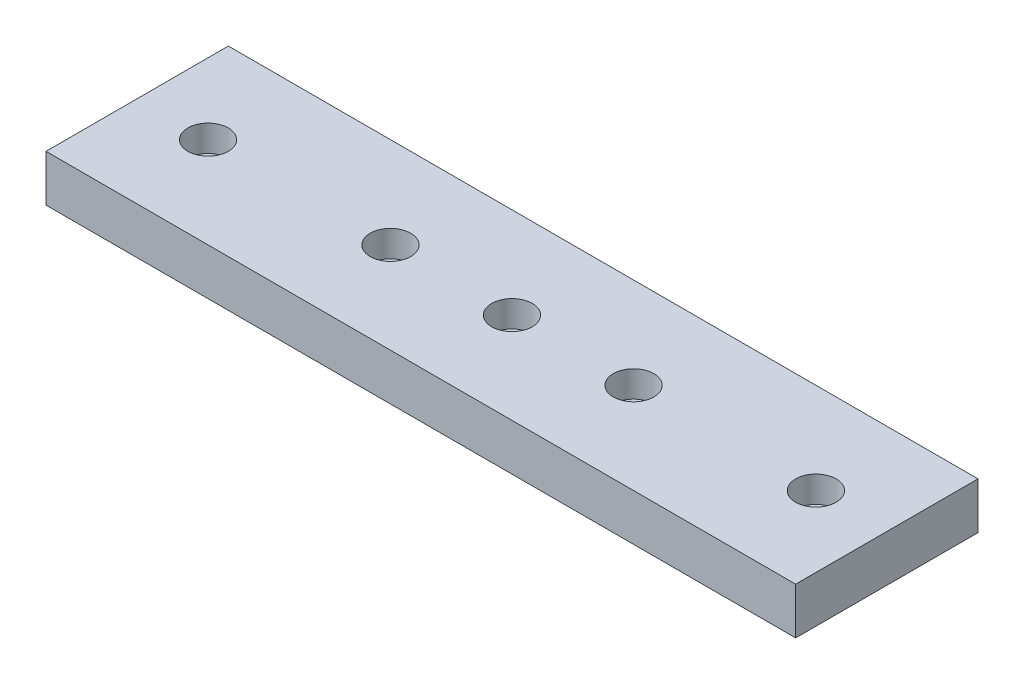
ISO-10303-21;
HEADER;
FILE_DESCRIPTION(('STEP AP214'),'2;1');
FILE_NAME('part.step','',(''),(''),'','','');
FILE_SCHEMA(('AUTOMOTIVE_DESIGN { 1 0 10303 214 1 1 1 1 }'));
ENDSEC;
DATA;
#1=APPLICATION_CONTEXT('core data for automotive mechanical design processes');
#2=APPLICATION_PROTOCOL_DEFINITION('international standard','automotive_design',2000,#1);
#3=PRODUCT_CONTEXT('',#1,'mechanical');
#4=PRODUCT('Part','Part','',(#3));
#5=PRODUCT_RELATED_PRODUCT_CATEGORY('part','',(#4));
#6=PRODUCT_DEFINITION_FORMATION('','',#4);
#7=PRODUCT_DEFINITION_CONTEXT('part definition',#1,'design');
#8=PRODUCT_DEFINITION('design','',#6,#7);
#9=PRODUCT_DEFINITION_SHAPE('','',#8);
#10=(LENGTH_UNIT() NAMED_UNIT(*) SI_UNIT(.MILLI.,.METRE.));
#11=(NAMED_UNIT(*) PLANE_ANGLE_UNIT() SI_UNIT($,.RADIAN.));
#12=(NAMED_UNIT(*) SI_UNIT($,.STERADIAN.) SOLID_ANGLE_UNIT());
#13=UNCERTAINTY_MEASURE_WITH_UNIT(LENGTH_MEASURE(1.E-05),#10,'distance_accuracy_value','');
#14=(GEOMETRIC_REPRESENTATION_CONTEXT(3) GLOBAL_UNCERTAINTY_ASSIGNED_CONTEXT((#13)) GLOBAL_UNIT_ASSIGNED_CONTEXT((#10,
#11,#12)) REPRESENTATION_CONTEXT('',''));
#15=CARTESIAN_POINT('',(0.,0.,0.));
#16=DIRECTION('',(0.,0.,1.));
#17=DIRECTION('',(1.,0.,0.));
#18=AXIS2_PLACEMENT_3D('',#15,#16,#17);
#19=CARTESIAN_POINT('',(150.,23.,0.));
#20=DIRECTION('',(0.,1.,0.));
#21=DIRECTION('',(0.,0.,1.));
#22=AXIS2_PLACEMENT_3D('',#19,#20,#21);
#23=CYLINDRICAL_SURFACE('',#22,6.75000000000001);
#24=CARTESIAN_POINT('',(150.,0.,0.));
#25=DIRECTION('',(0.,1.,0.));
#26=DIRECTION('',(0.,0.,1.));
#27=AXIS2_PLACEMENT_3D('',#24,#25,#26);
#28=CIRCLE('',#27,6.75000000000001);
#29=CARTESIAN_POINT('',(150.,0.,6.74999999999992));
#30=VERTEX_POINT('',#29);
#31=EDGE_CURVE('E11',#30,#30,#28,.T.);
#32=ORIENTED_EDGE('',*,*,#31,.F.);
#33=EDGE_LOOP('',(#32));
#34=FACE_BOUND('',#33,.T.);
#35=CARTESIAN_POINT('',(150.,10.,0.));
#36=DIRECTION('',(0.,1.,0.));
#37=DIRECTION('',(0.,0.,1.));
#38=AXIS2_PLACEMENT_3D('',#35,#36,#37);
#39=CIRCLE('',#38,6.75000000000001);
#40=CARTESIAN_POINT('',(150.,10.,6.74999999999992));
#41=VERTEX_POINT('',#40);
#42=EDGE_CURVE('E48',#41,#41,#39,.T.);
#43=ORIENTED_EDGE('',*,*,#42,.T.);
#44=EDGE_LOOP('',(#43));
#45=FACE_BOUND('',#44,.T.);
#46=ADVANCED_FACE('F39',(#34,#45),#23,.F.);
#47=CARTESIAN_POINT('',(156.75,10.,0.));
#48=DIRECTION('',(0.,-1.,0.));
#49=DIRECTION('',(0.,0.,-1.));
#50=AXIS2_PLACEMENT_3D('',#47,#48,#49);
#51=PLANE('',#50);
#52=ORIENTED_EDGE('',*,*,#42,.F.);
#53=EDGE_LOOP('',(#52));
#54=FACE_BOUND('',#53,.T.);
#55=CARTESIAN_POINT('',(150.,10.,0.));
#56=DIRECTION('',(0.,1.,0.));
#57=DIRECTION('',(0.,0.,1.));
#58=AXIS2_PLACEMENT_3D('',#55,#56,#57);
#59=CIRCLE('',#58,10.);
#60=CARTESIAN_POINT('',(150.,10.,9.99999999999992));
#61=VERTEX_POINT('',#60);
#62=EDGE_CURVE('E161',#61,#61,#59,.T.);
#63=ORIENTED_EDGE('',*,*,#62,.T.);
#64=EDGE_LOOP('',(#63));
#65=FACE_BOUND('',#64,.T.);
#66=ADVANCED_FACE('F173',(#54,#65),#51,.F.);
#67=CARTESIAN_POINT('',(150.,23.,0.));
#68=DIRECTION('',(0.,1.,0.));
#69=DIRECTION('',(0.,0.,1.));
#70=AXIS2_PLACEMENT_3D('',#67,#68,#69);
#71=CYLINDRICAL_SURFACE('',#70,10.);
#72=ORIENTED_EDGE('',*,*,#62,.F.);
#73=EDGE_LOOP('',(#72));
#74=FACE_BOUND('',#73,.T.);
#75=CARTESIAN_POINT('',(150.,23.,0.));
#76=DIRECTION('',(0.,1.,0.));
#77=DIRECTION('',(0.,0.,1.));
#78=AXIS2_PLACEMENT_3D('',#75,#76,#77);
#79=CIRCLE('',#78,10.);
#80=CARTESIAN_POINT('',(150.,23.,9.99999999999992));
#81=VERTEX_POINT('',#80);
#82=EDGE_CURVE('E165',#81,#81,#79,.T.);
#83=ORIENTED_EDGE('',*,*,#82,.T.);
#84=EDGE_LOOP('',(#83));
#85=FACE_BOUND('',#84,.T.);
#86=ADVANCED_FACE('F176',(#74,#85),#71,.F.);
#87=CARTESIAN_POINT('',(60.,23.,0.));
#88=DIRECTION('',(0.,1.,0.));
#89=DIRECTION('',(0.,0.,1.));
#90=AXIS2_PLACEMENT_3D('',#87,#88,#89);
#91=CYLINDRICAL_SURFACE('',#90,6.75000000000001);
#92=CARTESIAN_POINT('',(60.,0.,0.));
#93=DIRECTION('',(0.,1.,0.));
#94=DIRECTION('',(0.,0.,1.));
#95=AXIS2_PLACEMENT_3D('',#92,#93,#94);
#96=CIRCLE('',#95,6.75000000000001);
#97=CARTESIAN_POINT('',(60.,0.,6.74999999999993));
#98=VERTEX_POINT('',#97);
#99=EDGE_CURVE('E157',#98,#98,#96,.T.);
#100=ORIENTED_EDGE('',*,*,#99,.F.);
#101=EDGE_LOOP('',(#100));
#102=FACE_BOUND('',#101,.T.);
#103=CARTESIAN_POINT('',(60.,10.,0.));
#104=DIRECTION('',(0.,1.,0.));
#105=DIRECTION('',(0.,0.,1.));
#106=AXIS2_PLACEMENT_3D('',#103,#104,#105);
#107=CIRCLE('',#106,6.75000000000001);
#108=CARTESIAN_POINT('',(60.,10.,6.74999999999993));
#109=VERTEX_POINT('',#108);
#110=EDGE_CURVE('E153',#109,#109,#107,.T.);
#111=ORIENTED_EDGE('',*,*,#110,.T.);
#112=EDGE_LOOP('',(#111));
#113=FACE_BOUND('',#112,.T.);
#114=ADVANCED_FACE('F181',(#102,#113),#91,.F.);
#115=CARTESIAN_POINT('',(66.75,10.,0.));
#116=DIRECTION('',(0.,-1.,0.));
#117=DIRECTION('',(0.,0.,-1.));
#118=AXIS2_PLACEMENT_3D('',#115,#116,#117);
#119=PLANE('',#118);
#120=ORIENTED_EDGE('',*,*,#110,.F.);
#121=EDGE_LOOP('',(#120));
#122=FACE_BOUND('',#121,.T.);
#123=CARTESIAN_POINT('',(60.,10.,0.));
#124=DIRECTION('',(0.,1.,0.));
#125=DIRECTION('',(0.,0.,1.));
#126=AXIS2_PLACEMENT_3D('',#123,#124,#125);
#127=CIRCLE('',#126,10.);
#128=CARTESIAN_POINT('',(60.,10.,9.99999999999994));
#129=VERTEX_POINT('',#128);
#130=EDGE_CURVE('E145',#129,#129,#127,.T.);
#131=ORIENTED_EDGE('',*,*,#130,.T.);
#132=EDGE_LOOP('',(#131));
#133=FACE_BOUND('',#132,.T.);
#134=ADVANCED_FACE('F293',(#122,#133),#119,.F.);
#135=CARTESIAN_POINT('',(60.,23.,0.));
#136=DIRECTION('',(0.,1.,0.));
#137=DIRECTION('',(0.,0.,1.));
#138=AXIS2_PLACEMENT_3D('',#135,#136,#137);
#139=CYLINDRICAL_SURFACE('',#138,10.);
#140=ORIENTED_EDGE('',*,*,#130,.F.);
#141=EDGE_LOOP('',(#140));
#142=FACE_BOUND('',#141,.T.);
#143=CARTESIAN_POINT('',(60.,23.,0.));
#144=DIRECTION('',(0.,1.,0.));
#145=DIRECTION('',(0.,0.,1.));
#146=AXIS2_PLACEMENT_3D('',#143,#144,#145);
#147=CIRCLE('',#146,10.);
#148=CARTESIAN_POINT('',(60.,23.,9.99999999999994));
#149=VERTEX_POINT('',#148);
#150=EDGE_CURVE('E149',#149,#149,#147,.T.);
#151=ORIENTED_EDGE('',*,*,#150,.T.);
#152=EDGE_LOOP('',(#151));
#153=FACE_BOUND('',#152,.T.);
#154=ADVANCED_FACE('F270',(#142,#153),#139,.F.);
#155=CARTESIAN_POINT('',(0.,23.,0.));
#156=DIRECTION('',(0.,1.,0.));
#157=DIRECTION('',(0.,0.,1.));
#158=AXIS2_PLACEMENT_3D('',#155,#156,#157);
#159=CYLINDRICAL_SURFACE('',#158,6.75000000000001);
#160=CARTESIAN_POINT('',(0.,0.,0.));
#161=DIRECTION('',(0.,1.,0.));
#162=DIRECTION('',(0.,0.,1.));
#163=AXIS2_PLACEMENT_3D('',#160,#161,#162);
#164=CIRCLE('',#163,6.75000000000001);
#165=CARTESIAN_POINT('',(0.,0.,6.74999999999994));
#166=VERTEX_POINT('',#165);
#167=EDGE_CURVE('E141',#166,#166,#164,.T.);
#168=ORIENTED_EDGE('',*,*,#167,.F.);
#169=EDGE_LOOP('',(#168));
#170=FACE_BOUND('',#169,.T.);
#171=CARTESIAN_POINT('',(0.,10.,0.));
#172=DIRECTION('',(0.,1.,0.));
#173=DIRECTION('',(0.,0.,1.));
#174=AXIS2_PLACEMENT_3D('',#171,#172,#173);
#175=CIRCLE('',#174,6.75000000000001);
#176=CARTESIAN_POINT('',(0.,10.,6.74999999999994));
#177=VERTEX_POINT('',#176);
#178=EDGE_CURVE('E137',#177,#177,#175,.T.);
#179=ORIENTED_EDGE('',*,*,#178,.T.);
#180=EDGE_LOOP('',(#179));
#181=FACE_BOUND('',#180,.T.);
#182=ADVANCED_FACE('F266',(#170,#181),#159,.F.);
#183=CARTESIAN_POINT('',(6.75000000000001,10.,0.));
#184=DIRECTION('',(0.,-1.,0.));
#185=DIRECTION('',(0.,0.,-1.));
#186=AXIS2_PLACEMENT_3D('',#183,#184,#185);
#187=PLANE('',#186);
#188=ORIENTED_EDGE('',*,*,#178,.F.);
#189=EDGE_LOOP('',(#188));
#190=FACE_BOUND('',#189,.T.);
#191=CARTESIAN_POINT('',(0.,10.,0.));
#192=DIRECTION('',(0.,1.,0.));
#193=DIRECTION('',(0.,0.,1.));
#194=AXIS2_PLACEMENT_3D('',#191,#192,#193);
#195=CIRCLE('',#194,10.);
#196=CARTESIAN_POINT('',(0.,10.,9.99999999999994));
#197=VERTEX_POINT('',#196);
#198=EDGE_CURVE('E129',#197,#197,#195,.T.);
#199=ORIENTED_EDGE('',*,*,#198,.T.);
#200=EDGE_LOOP('',(#199));
#201=FACE_BOUND('',#200,.T.);
#202=ADVANCED_FACE('F269',(#190,#201),#187,.F.);
#203=CARTESIAN_POINT('',(0.,23.,0.));
#204=DIRECTION('',(0.,1.,0.));
#205=DIRECTION('',(0.,0.,1.));
#206=AXIS2_PLACEMENT_3D('',#203,#204,#205);
#207=CYLINDRICAL_SURFACE('',#206,10.);
#208=ORIENTED_EDGE('',*,*,#198,.F.);
#209=EDGE_LOOP('',(#208));
#210=FACE_BOUND('',#209,.T.);
#211=CARTESIAN_POINT('',(0.,23.,0.));
#212=DIRECTION('',(0.,1.,0.));
#213=DIRECTION('',(0.,0.,1.));
#214=AXIS2_PLACEMENT_3D('',#211,#212,#213);
#215=CIRCLE('',#214,10.);
#216=CARTESIAN_POINT('',(0.,23.,9.99999999999994));
#217=VERTEX_POINT('',#216);
#218=EDGE_CURVE('E133',#217,#217,#215,.T.);
#219=ORIENTED_EDGE('',*,*,#218,.T.);
#220=EDGE_LOOP('',(#219));
#221=FACE_BOUND('',#220,.T.);
#222=ADVANCED_FACE('F276',(#210,#221),#207,.F.);
#223=CARTESIAN_POINT('',(-185.,23.,45.));
#224=DIRECTION('',(1.,0.,0.));
#225=DIRECTION('',(0.,0.,-1.));
#226=AXIS2_PLACEMENT_3D('',#223,#224,#225);
#227=PLANE('',#226);
#228=DIRECTION('',(0.,0.,1.));
#229=VECTOR('',#228,1.);
#230=CARTESIAN_POINT('',(-185.,0.,45.));
#231=LINE('',#230,#229);
#232=CARTESIAN_POINT('',(-185.,0.,-45.));
#233=VERTEX_POINT('',#232);
#234=CARTESIAN_POINT('',(-185.,0.,45.));
#235=VERTEX_POINT('',#234);
#236=EDGE_CURVE('E112',#233,#235,#231,.T.);
#237=ORIENTED_EDGE('',*,*,#236,.T.);
#238=DIRECTION('',(0.,-1.,0.));
#239=VECTOR('',#238,1.);
#240=CARTESIAN_POINT('',(-185.,23.,45.));
#241=LINE('',#240,#239);
#242=CARTESIAN_POINT('',(-185.,23.,45.));
#243=VERTEX_POINT('',#242);
#244=EDGE_CURVE('E100',#243,#235,#241,.T.);
#245=ORIENTED_EDGE('',*,*,#244,.F.);
#246=DIRECTION('',(0.,0.,1.));
#247=VECTOR('',#246,1.);
#248=CARTESIAN_POINT('',(-185.,23.,45.));
#249=LINE('',#248,#247);
#250=CARTESIAN_POINT('',(-185.,23.,-45.));
#251=VERTEX_POINT('',#250);
#252=EDGE_CURVE('E92',#251,#243,#249,.T.);
#253=ORIENTED_EDGE('',*,*,#252,.F.);
#254=DIRECTION('',(0.,-1.,0.));
#255=VECTOR('',#254,1.);
#256=CARTESIAN_POINT('',(-185.,23.,-45.));
#257=LINE('',#256,#255);
#258=EDGE_CURVE('E108',#251,#233,#257,.T.);
#259=ORIENTED_EDGE('',*,*,#258,.T.);
#260=EDGE_LOOP('',(#237,#245,#253,#259));
#261=FACE_BOUND('',#260,.T.);
#262=ADVANCED_FACE('F282',(#261),#227,.F.);
#263=CARTESIAN_POINT('',(185.,23.,45.));
#264=DIRECTION('',(0.,0.,-1.));
#265=DIRECTION('',(-1.,0.,0.));
#266=AXIS2_PLACEMENT_3D('',#263,#264,#265);
#267=PLANE('',#266);
#268=DIRECTION('',(1.,0.,0.));
#269=VECTOR('',#268,1.);
#270=CARTESIAN_POINT('',(185.,0.,45.));
#271=LINE('',#270,#269);
#272=CARTESIAN_POINT('',(185.,0.,45.));
#273=VERTEX_POINT('',#272);
#274=EDGE_CURVE('E98',#235,#273,#271,.T.);
#275=ORIENTED_EDGE('',*,*,#274,.T.);
#276=DIRECTION('',(0.,-1.,0.));
#277=VECTOR('',#276,1.);
#278=CARTESIAN_POINT('',(185.,23.,45.));
#279=LINE('',#278,#277);
#280=CARTESIAN_POINT('',(185.,23.,45.));
#281=VERTEX_POINT('',#280);
#282=EDGE_CURVE('E96',#281,#273,#279,.T.);
#283=ORIENTED_EDGE('',*,*,#282,.F.);
#284=DIRECTION('',(1.,0.,0.));
#285=VECTOR('',#284,1.);
#286=CARTESIAN_POINT('',(185.,23.,45.));
#287=LINE('',#286,#285);
#288=EDGE_CURVE('E87',#243,#281,#287,.T.);
#289=ORIENTED_EDGE('',*,*,#288,.F.);
#290=ORIENTED_EDGE('',*,*,#244,.T.);
#291=EDGE_LOOP('',(#275,#283,#289,#290));
#292=FACE_BOUND('',#291,.T.);
#293=ADVANCED_FACE('F97',(#292),#267,.F.);
#294=CARTESIAN_POINT('',(185.,23.,45.));
#295=DIRECTION('',(-1.,0.,0.));
#296=DIRECTION('',(0.,0.,1.));
#297=AXIS2_PLACEMENT_3D('',#294,#295,#296);
#298=PLANE('',#297);
#299=DIRECTION('',(0.,0.,-1.));
#300=VECTOR('',#299,1.);
#301=CARTESIAN_POINT('',(185.,0.,45.));
#302=LINE('',#301,#300);
#303=CARTESIAN_POINT('',(185.,0.,-45.));
#304=VERTEX_POINT('',#303);
#305=EDGE_CURVE('E73',#273,#304,#302,.T.);
#306=ORIENTED_EDGE('',*,*,#305,.T.);
#307=DIRECTION('',(0.,-1.,0.));
#308=VECTOR('',#307,1.);
#309=CARTESIAN_POINT('',(185.,23.,-45.));
#310=LINE('',#309,#308);
#311=CARTESIAN_POINT('',(185.,23.,-45.));
#312=VERTEX_POINT('',#311);
#313=EDGE_CURVE('E101',#312,#304,#310,.T.);
#314=ORIENTED_EDGE('',*,*,#313,.F.);
#315=DIRECTION('',(0.,0.,-1.));
#316=VECTOR('',#315,1.);
#317=CARTESIAN_POINT('',(185.,23.,45.));
#318=LINE('',#317,#316);
#319=EDGE_CURVE('E90',#281,#312,#318,.T.);
#320=ORIENTED_EDGE('',*,*,#319,.F.);
#321=ORIENTED_EDGE('',*,*,#282,.T.);
#322=EDGE_LOOP('',(#306,#314,#320,#321));
#323=FACE_BOUND('',#322,.T.);
#324=ADVANCED_FACE('F103',(#323),#298,.F.);
#325=CARTESIAN_POINT('',(185.,23.,-45.));
#326=DIRECTION('',(0.,0.,1.));
#327=DIRECTION('',(1.,0.,0.));
#328=AXIS2_PLACEMENT_3D('',#325,#326,#327);
#329=PLANE('',#328);
#330=DIRECTION('',(-1.,0.,0.));
#331=VECTOR('',#330,1.);
#332=CARTESIAN_POINT('',(185.,0.,-45.));
#333=LINE('',#332,#331);
#334=EDGE_CURVE('E79',#304,#233,#333,.T.);
#335=ORIENTED_EDGE('',*,*,#334,.T.);
#336=ORIENTED_EDGE('',*,*,#258,.F.);
#337=DIRECTION('',(-1.,0.,0.));
#338=VECTOR('',#337,1.);
#339=CARTESIAN_POINT('',(185.,23.,-45.));
#340=LINE('',#339,#338);
#341=EDGE_CURVE('E56',#312,#251,#340,.T.);
#342=ORIENTED_EDGE('',*,*,#341,.F.);
#343=ORIENTED_EDGE('',*,*,#313,.T.);
#344=EDGE_LOOP('',(#335,#336,#342,#343));
#345=FACE_BOUND('',#344,.T.);
#346=ADVANCED_FACE('F188',(#345),#329,.F.);
#347=CARTESIAN_POINT('',(0.,23.,0.));
#348=DIRECTION('',(0.,1.,0.));
#349=DIRECTION('',(0.,0.,1.));
#350=AXIS2_PLACEMENT_3D('',#347,#348,#349);
#351=PLANE('',#350);
#352=ORIENTED_EDGE('',*,*,#82,.F.);
#353=EDGE_LOOP('',(#352));
#354=FACE_BOUND('',#353,.T.);
#355=ORIENTED_EDGE('',*,*,#150,.F.);
#356=EDGE_LOOP('',(#355));
#357=FACE_BOUND('',#356,.T.);
#358=ORIENTED_EDGE('',*,*,#218,.F.);
#359=EDGE_LOOP('',(#358));
#360=FACE_BOUND('',#359,.T.);
#361=CARTESIAN_POINT('',(-60.,23.,0.));
#362=DIRECTION('',(0.,1.,0.));
#363=DIRECTION('',(0.,0.,1.));
#364=AXIS2_PLACEMENT_3D('',#361,#362,#363);
#365=CIRCLE('',#364,10.);
#366=CARTESIAN_POINT('',(-60.,23.,9.99999999999995));
#367=VERTEX_POINT('',#366);
#368=EDGE_CURVE('E197',#367,#367,#365,.T.);
#369=ORIENTED_EDGE('',*,*,#368,.F.);
#370=EDGE_LOOP('',(#369));
#371=FACE_BOUND('',#370,.T.);
#372=CARTESIAN_POINT('',(-150.,23.,0.));
#373=DIRECTION('',(0.,1.,0.));
#374=DIRECTION('',(0.,0.,1.));
#375=AXIS2_PLACEMENT_3D('',#372,#373,#374);
#376=CIRCLE('',#375,10.);
#377=CARTESIAN_POINT('',(-150.,23.,9.99999999999997));
#378=VERTEX_POINT('',#377);
#379=EDGE_CURVE('E200',#378,#378,#376,.T.);
#380=ORIENTED_EDGE('',*,*,#379,.F.);
#381=EDGE_LOOP('',(#380));
#382=FACE_BOUND('',#381,.T.);
#383=ORIENTED_EDGE('',*,*,#252,.T.);
#384=ORIENTED_EDGE('',*,*,#288,.T.);
#385=ORIENTED_EDGE('',*,*,#319,.T.);
#386=ORIENTED_EDGE('',*,*,#341,.T.);
#387=EDGE_LOOP('',(#383,#384,#385,#386));
#388=FACE_BOUND('',#387,.T.);
#389=ADVANCED_FACE('F88',(#354,#357,#360,#371,#382,#388),#351,.T.);
#390=CARTESIAN_POINT('',(0.,0.,0.));
#391=DIRECTION('',(0.,1.,0.));
#392=DIRECTION('',(0.,0.,1.));
#393=AXIS2_PLACEMENT_3D('',#390,#391,#392);
#394=PLANE('',#393);
#395=ORIENTED_EDGE('',*,*,#31,.T.);
#396=EDGE_LOOP('',(#395));
#397=FACE_BOUND('',#396,.T.);
#398=ORIENTED_EDGE('',*,*,#99,.T.);
#399=EDGE_LOOP('',(#398));
#400=FACE_BOUND('',#399,.T.);
#401=ORIENTED_EDGE('',*,*,#167,.T.);
#402=EDGE_LOOP('',(#401));
#403=FACE_BOUND('',#402,.T.);
#404=CARTESIAN_POINT('',(-60.,0.,0.));
#405=DIRECTION('',(0.,1.,0.));
#406=DIRECTION('',(0.,0.,1.));
#407=AXIS2_PLACEMENT_3D('',#404,#405,#406);
#408=CIRCLE('',#407,6.75000000000001);
#409=CARTESIAN_POINT('',(-60.,0.,6.74999999999995));
#410=VERTEX_POINT('',#409);
#411=EDGE_CURVE('E223',#410,#410,#408,.T.);
#412=ORIENTED_EDGE('',*,*,#411,.T.);
#413=EDGE_LOOP('',(#412));
#414=FACE_BOUND('',#413,.T.);
#415=CARTESIAN_POINT('',(-150.,0.,0.));
#416=DIRECTION('',(0.,1.,0.));
#417=DIRECTION('',(0.,0.,1.));
#418=AXIS2_PLACEMENT_3D('',#415,#416,#417);
#419=CIRCLE('',#418,6.75000000000001);
#420=CARTESIAN_POINT('',(-150.,0.,6.74999999999996));
#421=VERTEX_POINT('',#420);
#422=EDGE_CURVE('E116',#421,#421,#419,.T.);
#423=ORIENTED_EDGE('',*,*,#422,.T.);
#424=EDGE_LOOP('',(#423));
#425=FACE_BOUND('',#424,.T.);
#426=ORIENTED_EDGE('',*,*,#236,.F.);
#427=ORIENTED_EDGE('',*,*,#334,.F.);
#428=ORIENTED_EDGE('',*,*,#305,.F.);
#429=ORIENTED_EDGE('',*,*,#274,.F.);
#430=EDGE_LOOP('',(#426,#427,#428,#429));
#431=FACE_BOUND('',#430,.T.);
#432=ADVANCED_FACE('F187',(#397,#400,#403,#414,#425,#431),#394,.F.);
#433=CARTESIAN_POINT('',(-150.,23.,0.));
#434=DIRECTION('',(0.,1.,0.));
#435=DIRECTION('',(0.,0.,1.));
#436=AXIS2_PLACEMENT_3D('',#433,#434,#435);
#437=CYLINDRICAL_SURFACE('',#436,6.75000000000001);
#438=ORIENTED_EDGE('',*,*,#422,.F.);
#439=EDGE_LOOP('',(#438));
#440=FACE_BOUND('',#439,.T.);
#441=CARTESIAN_POINT('',(-150.,10.,0.));
#442=DIRECTION('',(0.,1.,0.));
#443=DIRECTION('',(0.,0.,1.));
#444=AXIS2_PLACEMENT_3D('',#441,#442,#443);
#445=CIRCLE('',#444,6.75000000000001);
#446=CARTESIAN_POINT('',(-150.,10.,6.74999999999996));
#447=VERTEX_POINT('',#446);
#448=EDGE_CURVE('E207',#447,#447,#445,.T.);
#449=ORIENTED_EDGE('',*,*,#448,.T.);
#450=EDGE_LOOP('',(#449));
#451=FACE_BOUND('',#450,.T.);
#452=ADVANCED_FACE('F260',(#440,#451),#437,.F.);
#453=CARTESIAN_POINT('',(-143.25,10.,0.));
#454=DIRECTION('',(0.,-1.,0.));
#455=DIRECTION('',(0.,0.,-1.));
#456=AXIS2_PLACEMENT_3D('',#453,#454,#455);
#457=PLANE('',#456);
#458=ORIENTED_EDGE('',*,*,#448,.F.);
#459=EDGE_LOOP('',(#458));
#460=FACE_BOUND('',#459,.T.);
#461=CARTESIAN_POINT('',(-150.,10.,0.));
#462=DIRECTION('',(0.,1.,0.));
#463=DIRECTION('',(0.,0.,1.));
#464=AXIS2_PLACEMENT_3D('',#461,#462,#463);
#465=CIRCLE('',#464,10.);
#466=CARTESIAN_POINT('',(-150.,10.,9.99999999999997));
#467=VERTEX_POINT('',#466);
#468=EDGE_CURVE('E202',#467,#467,#465,.T.);
#469=ORIENTED_EDGE('',*,*,#468,.T.);
#470=EDGE_LOOP('',(#469));
#471=FACE_BOUND('',#470,.T.);
#472=ADVANCED_FACE('F368',(#460,#471),#457,.F.);
#473=CARTESIAN_POINT('',(-150.,23.,0.));
#474=DIRECTION('',(0.,1.,0.));
#475=DIRECTION('',(0.,0.,1.));
#476=AXIS2_PLACEMENT_3D('',#473,#474,#475);
#477=CYLINDRICAL_SURFACE('',#476,10.);
#478=ORIENTED_EDGE('',*,*,#468,.F.);
#479=EDGE_LOOP('',(#478));
#480=FACE_BOUND('',#479,.T.);
#481=ORIENTED_EDGE('',*,*,#379,.T.);
#482=EDGE_LOOP('',(#481));
#483=FACE_BOUND('',#482,.T.);
#484=ADVANCED_FACE('F237',(#480,#483),#477,.F.);
#485=CARTESIAN_POINT('',(-60.,23.,0.));
#486=DIRECTION('',(0.,1.,0.));
#487=DIRECTION('',(0.,0.,1.));
#488=AXIS2_PLACEMENT_3D('',#485,#486,#487);
#489=CYLINDRICAL_SURFACE('',#488,6.75000000000001);
#490=ORIENTED_EDGE('',*,*,#411,.F.);
#491=EDGE_LOOP('',(#490));
#492=FACE_BOUND('',#491,.T.);
#493=CARTESIAN_POINT('',(-60.,10.,0.));
#494=DIRECTION('',(0.,1.,0.));
#495=DIRECTION('',(0.,0.,1.));
#496=AXIS2_PLACEMENT_3D('',#493,#494,#495);
#497=CIRCLE('',#496,6.75000000000001);
#498=CARTESIAN_POINT('',(-60.,10.,6.74999999999995));
#499=VERTEX_POINT('',#498);
#500=EDGE_CURVE('E203',#499,#499,#497,.T.);
#501=ORIENTED_EDGE('',*,*,#500,.T.);
#502=EDGE_LOOP('',(#501));
#503=FACE_BOUND('',#502,.T.);
#504=ADVANCED_FACE('F233',(#492,#503),#489,.F.);
#505=CARTESIAN_POINT('',(-53.25,10.,0.));
#506=DIRECTION('',(0.,-1.,0.));
#507=DIRECTION('',(0.,0.,-1.));
#508=AXIS2_PLACEMENT_3D('',#505,#506,#507);
#509=PLANE('',#508);
#510=ORIENTED_EDGE('',*,*,#500,.F.);
#511=EDGE_LOOP('',(#510));
#512=FACE_BOUND('',#511,.T.);
#513=CARTESIAN_POINT('',(-60.,10.,0.));
#514=DIRECTION('',(0.,1.,0.));
#515=DIRECTION('',(0.,0.,1.));
#516=AXIS2_PLACEMENT_3D('',#513,#514,#515);
#517=CIRCLE('',#516,10.);
#518=CARTESIAN_POINT('',(-60.,10.,9.99999999999995));
#519=VERTEX_POINT('',#518);
#520=EDGE_CURVE('E211',#519,#519,#517,.T.);
#521=ORIENTED_EDGE('',*,*,#520,.T.);
#522=EDGE_LOOP('',(#521));
#523=FACE_BOUND('',#522,.T.);
#524=ADVANCED_FACE('F236',(#512,#523),#509,.F.);
#525=CARTESIAN_POINT('',(-60.,23.,0.));
#526=DIRECTION('',(0.,1.,0.));
#527=DIRECTION('',(0.,0.,1.));
#528=AXIS2_PLACEMENT_3D('',#525,#526,#527);
#529=CYLINDRICAL_SURFACE('',#528,10.);
#530=ORIENTED_EDGE('',*,*,#520,.F.);
#531=EDGE_LOOP('',(#530));
#532=FACE_BOUND('',#531,.T.);
#533=ORIENTED_EDGE('',*,*,#368,.T.);
#534=EDGE_LOOP('',(#533));
#535=FACE_BOUND('',#534,.T.);
#536=ADVANCED_FACE('F243',(#532,#535),#529,.F.);
#537=CLOSED_SHELL('',(#46,#66,#86,#114,#134,#154,#182,#202,#222,#262,#293,#324,#346,#389,#432,
#452,#472,#484,#504,#524,#536));
#538=MANIFOLD_SOLID_BREP('B2',#537);
#539=ADVANCED_BREP_SHAPE_REPRESENTATION('',(#18,#538),#14);
#540=SHAPE_DEFINITION_REPRESENTATION(#9,#539);
ENDSEC;
END-ISO-10303-21;
